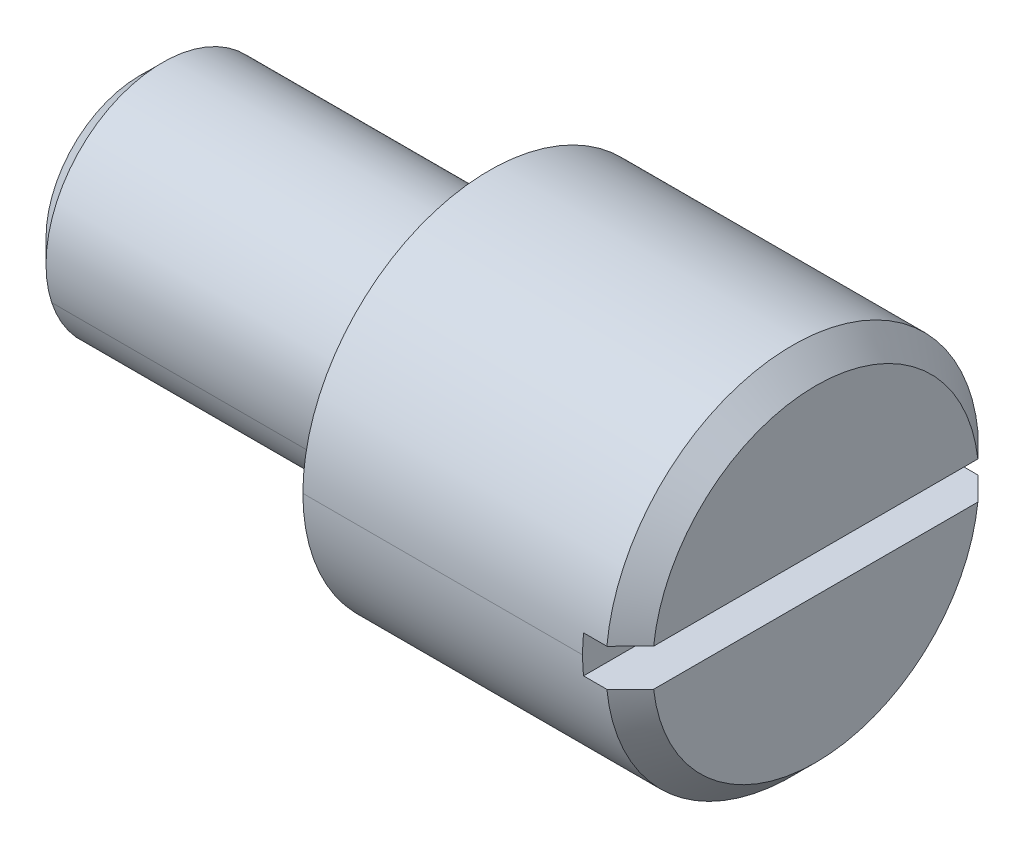
ISO-10303-21;
HEADER;
FILE_DESCRIPTION(('STEP AP214'),'2;1');
FILE_NAME('part.step','',(''),(''),'','','');
FILE_SCHEMA(('AUTOMOTIVE_DESIGN { 1 0 10303 214 1 1 1 1 }'));
ENDSEC;
DATA;
#1=APPLICATION_CONTEXT('core data for automotive mechanical design processes');
#2=APPLICATION_PROTOCOL_DEFINITION('international standard','automotive_design',2000,#1);
#3=PRODUCT_CONTEXT('',#1,'mechanical');
#4=PRODUCT('Part','Part','',(#3));
#5=PRODUCT_RELATED_PRODUCT_CATEGORY('part','',(#4));
#6=PRODUCT_DEFINITION_FORMATION('','',#4);
#7=PRODUCT_DEFINITION_CONTEXT('part definition',#1,'design');
#8=PRODUCT_DEFINITION('design','',#6,#7);
#9=PRODUCT_DEFINITION_SHAPE('','',#8);
#10=(LENGTH_UNIT() NAMED_UNIT(*) SI_UNIT(.MILLI.,.METRE.));
#11=(NAMED_UNIT(*) PLANE_ANGLE_UNIT() SI_UNIT($,.RADIAN.));
#12=(NAMED_UNIT(*) SI_UNIT($,.STERADIAN.) SOLID_ANGLE_UNIT());
#13=UNCERTAINTY_MEASURE_WITH_UNIT(LENGTH_MEASURE(1.E-05),#10,'distance_accuracy_value','');
#14=(GEOMETRIC_REPRESENTATION_CONTEXT(3) GLOBAL_UNCERTAINTY_ASSIGNED_CONTEXT((#13)) GLOBAL_UNIT_ASSIGNED_CONTEXT((#10,
#11,#12)) REPRESENTATION_CONTEXT('',''));
#15=CARTESIAN_POINT('',(0.,0.,0.));
#16=DIRECTION('',(0.,0.,1.));
#17=DIRECTION('',(1.,0.,0.));
#18=AXIS2_PLACEMENT_3D('',#15,#16,#17);
#19=CARTESIAN_POINT('',(7.,0.,0.));
#20=DIRECTION('',(1.,0.,0.));
#21=DIRECTION('',(0.,1.,0.));
#22=AXIS2_PLACEMENT_3D('',#19,#20,#21);
#23=CYLINDRICAL_SURFACE('',#22,4.);
#24=DIRECTION('',(1.,0.,0.));
#25=VECTOR('',#24,1.);
#26=CARTESIAN_POINT('',(0.,0.,4.));
#27=LINE('',#26,#25);
#28=CARTESIAN_POINT('',(0.,0.,4.));
#29=VERTEX_POINT('',#28);
#30=CARTESIAN_POINT('',(6.,0.,4.));
#31=VERTEX_POINT('',#30);
#32=EDGE_CURVE('E10',#29,#31,#27,.T.);
#33=ORIENTED_EDGE('',*,*,#32,.F.);
#34=CARTESIAN_POINT('',(0.,0.,0.));
#35=DIRECTION('',(1.,0.,0.));
#36=DIRECTION('',(0.,0.,-1.));
#37=AXIS2_PLACEMENT_3D('',#34,#35,#36);
#38=CIRCLE('',#37,4.);
#39=CARTESIAN_POINT('',(0.,0.,-4.));
#40=VERTEX_POINT('',#39);
#41=EDGE_CURVE('E24',#29,#40,#38,.T.);
#42=ORIENTED_EDGE('',*,*,#41,.T.);
#43=DIRECTION('',(1.,0.,0.));
#44=VECTOR('',#43,1.);
#45=CARTESIAN_POINT('',(0.,0.,-4.));
#46=LINE('',#45,#44);
#47=CARTESIAN_POINT('',(6.,0.,-4.));
#48=VERTEX_POINT('',#47);
#49=EDGE_CURVE('E420',#40,#48,#46,.T.);
#50=ORIENTED_EDGE('',*,*,#49,.T.);
#51=CARTESIAN_POINT('',(6.,0.,0.));
#52=DIRECTION('',(1.,0.,0.));
#53=DIRECTION('',(0.,0.,-1.));
#54=AXIS2_PLACEMENT_3D('',#51,#52,#53);
#55=CIRCLE('',#54,4.);
#56=CARTESIAN_POINT('',(6.,-0.4,-3.97994974842648));
#57=VERTEX_POINT('',#56);
#58=EDGE_CURVE('E415',#57,#48,#55,.T.);
#59=ORIENTED_EDGE('',*,*,#58,.F.);
#60=DIRECTION('',(-1.,0.,0.));
#61=VECTOR('',#60,1.);
#62=CARTESIAN_POINT('',(7.,-0.4,-3.97994974842648));
#63=LINE('',#62,#61);
#64=CARTESIAN_POINT('',(6.5,-0.4,-3.97994974842648));
#65=VERTEX_POINT('',#64);
#66=EDGE_CURVE('E411',#65,#57,#63,.T.);
#67=ORIENTED_EDGE('',*,*,#66,.F.);
#68=CARTESIAN_POINT('',(6.5,0.,0.));
#69=DIRECTION('',(1.,0.,0.));
#70=DIRECTION('',(0.,0.,-1.));
#71=AXIS2_PLACEMENT_3D('',#68,#69,#70);
#72=CIRCLE('',#71,4.);
#73=CARTESIAN_POINT('',(6.5,-0.4,3.97994974842648));
#74=VERTEX_POINT('',#73);
#75=EDGE_CURVE('E143',#74,#65,#72,.T.);
#76=ORIENTED_EDGE('',*,*,#75,.F.);
#77=DIRECTION('',(1.,0.,0.));
#78=VECTOR('',#77,1.);
#79=CARTESIAN_POINT('',(7.,-0.4,3.97994974842648));
#80=LINE('',#79,#78);
#81=CARTESIAN_POINT('',(6.,-0.4,3.97994974842648));
#82=VERTEX_POINT('',#81);
#83=EDGE_CURVE('E404',#82,#74,#80,.T.);
#84=ORIENTED_EDGE('',*,*,#83,.F.);
#85=CARTESIAN_POINT('',(6.,0.,0.));
#86=DIRECTION('',(1.,0.,0.));
#87=DIRECTION('',(0.,0.,-1.));
#88=AXIS2_PLACEMENT_3D('',#85,#86,#87);
#89=CIRCLE('',#88,4.);
#90=EDGE_CURVE('E399',#31,#82,#89,.T.);
#91=ORIENTED_EDGE('',*,*,#90,.F.);
#92=EDGE_LOOP('',(#33,#42,#50,#59,#67,#76,#84,#91));
#93=FACE_BOUND('',#92,.T.);
#94=ADVANCED_FACE('F16',(#93),#23,.T.);
#95=CARTESIAN_POINT('',(6.,0.4,8.));
#96=DIRECTION('',(1.,0.,0.));
#97=DIRECTION('',(0.,0.,-1.));
#98=AXIS2_PLACEMENT_3D('',#95,#96,#97);
#99=PLANE('',#98);
#100=CARTESIAN_POINT('',(6.,0.,0.));
#101=DIRECTION('',(1.,0.,0.));
#102=DIRECTION('',(0.,0.,-1.));
#103=AXIS2_PLACEMENT_3D('',#100,#101,#102);
#104=CIRCLE('',#103,4.);
#105=CARTESIAN_POINT('',(6.,0.4,3.97994974842648));
#106=VERTEX_POINT('',#105);
#107=EDGE_CURVE('E394',#106,#31,#104,.T.);
#108=ORIENTED_EDGE('',*,*,#107,.T.);
#109=ORIENTED_EDGE('',*,*,#90,.T.);
#110=DIRECTION('',(0.,0.,-1.));
#111=VECTOR('',#110,1.);
#112=CARTESIAN_POINT('',(6.,-0.4,8.));
#113=LINE('',#112,#111);
#114=EDGE_CURVE('E389',#82,#57,#113,.T.);
#115=ORIENTED_EDGE('',*,*,#114,.T.);
#116=ORIENTED_EDGE('',*,*,#58,.T.);
#117=CARTESIAN_POINT('',(6.,0.,0.));
#118=DIRECTION('',(1.,0.,0.));
#119=DIRECTION('',(0.,0.,-1.));
#120=AXIS2_PLACEMENT_3D('',#117,#118,#119);
#121=CIRCLE('',#120,4.);
#122=CARTESIAN_POINT('',(6.,0.4,-3.97994974842648));
#123=VERTEX_POINT('',#122);
#124=EDGE_CURVE('E385',#48,#123,#121,.T.);
#125=ORIENTED_EDGE('',*,*,#124,.T.);
#126=DIRECTION('',(0.,0.,-1.));
#127=VECTOR('',#126,1.);
#128=CARTESIAN_POINT('',(6.,0.4,8.));
#129=LINE('',#128,#127);
#130=EDGE_CURVE('E380',#106,#123,#129,.T.);
#131=ORIENTED_EDGE('',*,*,#130,.F.);
#132=EDGE_LOOP('',(#108,#109,#115,#116,#125,#131));
#133=FACE_BOUND('',#132,.T.);
#134=ADVANCED_FACE('F360',(#133),#99,.T.);
#135=CARTESIAN_POINT('',(7.,0.4,8.));
#136=DIRECTION('',(0.,-1.,0.));
#137=DIRECTION('',(0.,0.,-1.));
#138=AXIS2_PLACEMENT_3D('',#135,#136,#137);
#139=PLANE('',#138);
#140=DIRECTION('',(1.,0.,0.));
#141=VECTOR('',#140,1.);
#142=CARTESIAN_POINT('',(7.,0.4,-3.97994974842648));
#143=LINE('',#142,#141);
#144=CARTESIAN_POINT('',(6.5,0.4,-3.97994974842648));
#145=VERTEX_POINT('',#144);
#146=EDGE_CURVE('E378',#123,#145,#143,.T.);
#147=ORIENTED_EDGE('',*,*,#146,.T.);
#148=CARTESIAN_POINT('',(6.5,0.4,-3.97994974842648));
#149=CARTESIAN_POINT('',(6.66672719356399,0.4,-3.81238261406263));
#150=CARTESIAN_POINT('',(6.83340259039216,0.4,-3.64476389797192));
#151=CARTESIAN_POINT('',(7.,0.4,-3.47706773014274));
#152=B_SPLINE_CURVE_WITH_KNOTS('',3,(#148,#149,#150,#151),.UNSPECIFIED.,.F.,.F.,(4,4),(0.,1.),.UNSPECIFIED.);
#153=CARTESIAN_POINT('',(7.,0.4,-3.47706773014274));
#154=VERTEX_POINT('',#153);
#155=EDGE_CURVE('E376',#145,#154,#152,.T.);
#156=ORIENTED_EDGE('',*,*,#155,.T.);
#157=DIRECTION('',(0.,0.,1.));
#158=VECTOR('',#157,1.);
#159=CARTESIAN_POINT('',(7.,0.4,0.));
#160=LINE('',#159,#158);
#161=CARTESIAN_POINT('',(7.,0.4,3.47706773014274));
#162=VERTEX_POINT('',#161);
#163=EDGE_CURVE('E688',#154,#162,#160,.T.);
#164=ORIENTED_EDGE('',*,*,#163,.T.);
#165=CARTESIAN_POINT('',(7.,0.4,3.47706773014274));
#166=CARTESIAN_POINT('',(6.8334028568546,0.4,3.64476362975208));
#167=CARTESIAN_POINT('',(6.66672692689396,0.4,3.81238288207609));
#168=CARTESIAN_POINT('',(6.5,0.4,3.97994974842648));
#169=B_SPLINE_CURVE_WITH_KNOTS('',3,(#165,#166,#167,#168),.UNSPECIFIED.,.F.,.F.,(4,4),(0.,1.),.UNSPECIFIED.);
#170=CARTESIAN_POINT('',(6.5,0.4,3.97994974842648));
#171=VERTEX_POINT('',#170);
#172=EDGE_CURVE('E221',#162,#171,#169,.T.);
#173=ORIENTED_EDGE('',*,*,#172,.T.);
#174=DIRECTION('',(-1.,0.,0.));
#175=VECTOR('',#174,1.);
#176=CARTESIAN_POINT('',(7.,0.4,3.97994974842648));
#177=LINE('',#176,#175);
#178=EDGE_CURVE('E338',#171,#106,#177,.T.);
#179=ORIENTED_EDGE('',*,*,#178,.T.);
#180=ORIENTED_EDGE('',*,*,#130,.T.);
#181=EDGE_LOOP('',(#147,#156,#164,#173,#179,#180));
#182=FACE_BOUND('',#181,.T.);
#183=ADVANCED_FACE('F350',(#182),#139,.T.);
#184=CARTESIAN_POINT('',(7.,0.,0.));
#185=DIRECTION('',(1.,0.,0.));
#186=DIRECTION('',(0.,-1.,0.));
#187=AXIS2_PLACEMENT_3D('',#184,#185,#186);
#188=CYLINDRICAL_SURFACE('',#187,4.);
#189=ORIENTED_EDGE('',*,*,#32,.T.);
#190=ORIENTED_EDGE('',*,*,#107,.F.);
#191=ORIENTED_EDGE('',*,*,#178,.F.);
#192=CARTESIAN_POINT('',(6.5,0.,0.));
#193=DIRECTION('',(1.,0.,0.));
#194=DIRECTION('',(0.,0.,-1.));
#195=AXIS2_PLACEMENT_3D('',#192,#193,#194);
#196=CIRCLE('',#195,4.);
#197=EDGE_CURVE('E334',#145,#171,#196,.T.);
#198=ORIENTED_EDGE('',*,*,#197,.F.);
#199=ORIENTED_EDGE('',*,*,#146,.F.);
#200=ORIENTED_EDGE('',*,*,#124,.F.);
#201=ORIENTED_EDGE('',*,*,#49,.F.);
#202=CARTESIAN_POINT('',(0.,0.,0.));
#203=DIRECTION('',(1.,0.,0.));
#204=DIRECTION('',(0.,0.,-1.));
#205=AXIS2_PLACEMENT_3D('',#202,#203,#204);
#206=CIRCLE('',#205,4.);
#207=EDGE_CURVE('E330',#40,#29,#206,.T.);
#208=ORIENTED_EDGE('',*,*,#207,.T.);
#209=EDGE_LOOP('',(#189,#190,#191,#198,#199,#200,#201,#208));
#210=FACE_BOUND('',#209,.T.);
#211=ADVANCED_FACE('F359',(#210),#188,.T.);
#212=CARTESIAN_POINT('',(0.,0.,0.));
#213=DIRECTION('',(1.,0.,0.));
#214=DIRECTION('',(0.,0.,-1.));
#215=AXIS2_PLACEMENT_3D('',#212,#213,#214);
#216=PLANE('',#215);
#217=ORIENTED_EDGE('',*,*,#41,.F.);
#218=ORIENTED_EDGE('',*,*,#207,.F.);
#219=EDGE_LOOP('',(#217,#218));
#220=FACE_BOUND('',#219,.T.);
#221=CARTESIAN_POINT('',(0.,0.,0.));
#222=DIRECTION('',(1.,0.,0.));
#223=DIRECTION('',(0.,0.,-1.));
#224=AXIS2_PLACEMENT_3D('',#221,#222,#223);
#225=CIRCLE('',#224,2.0095);
#226=CARTESIAN_POINT('',(0.,0.,-2.0095));
#227=VERTEX_POINT('',#226);
#228=CARTESIAN_POINT('',(0.,0.,2.0095));
#229=VERTEX_POINT('',#228);
#230=EDGE_CURVE('E326',#227,#229,#225,.T.);
#231=ORIENTED_EDGE('',*,*,#230,.T.);
#232=CARTESIAN_POINT('',(0.,0.,0.));
#233=DIRECTION('',(1.,0.,0.));
#234=DIRECTION('',(0.,0.,-1.));
#235=AXIS2_PLACEMENT_3D('',#232,#233,#234);
#236=CIRCLE('',#235,2.0095);
#237=EDGE_CURVE('E322',#229,#227,#236,.T.);
#238=ORIENTED_EDGE('',*,*,#237,.T.);
#239=EDGE_LOOP('',(#231,#238));
#240=FACE_BOUND('',#239,.T.);
#241=ADVANCED_FACE('F438',(#220,#240),#216,.F.);
#242=CARTESIAN_POINT('',(0.,0.,0.));
#243=DIRECTION('',(1.,0.,0.));
#244=DIRECTION('',(0.,1.,0.));
#245=AXIS2_PLACEMENT_3D('',#242,#243,#244);
#246=CYLINDRICAL_SURFACE('',#245,2.0095);
#247=DIRECTION('',(1.,0.,0.));
#248=VECTOR('',#247,1.);
#249=CARTESIAN_POINT('',(-0.5,0.,2.0095));
#250=LINE('',#249,#248);
#251=CARTESIAN_POINT('',(-0.5,0.,2.0095));
#252=VERTEX_POINT('',#251);
#253=EDGE_CURVE('E317',#252,#229,#250,.T.);
#254=ORIENTED_EDGE('',*,*,#253,.F.);
#255=CARTESIAN_POINT('',(-0.5,0.,0.));
#256=DIRECTION('',(1.,0.,0.));
#257=DIRECTION('',(0.,0.,-1.));
#258=AXIS2_PLACEMENT_3D('',#255,#256,#257);
#259=CIRCLE('',#258,2.0095);
#260=CARTESIAN_POINT('',(-0.5,0.,-2.0095));
#261=VERTEX_POINT('',#260);
#262=EDGE_CURVE('E313',#252,#261,#259,.T.);
#263=ORIENTED_EDGE('',*,*,#262,.T.);
#264=DIRECTION('',(1.,0.,0.));
#265=VECTOR('',#264,1.);
#266=CARTESIAN_POINT('',(-0.5,0.,-2.0095));
#267=LINE('',#266,#265);
#268=EDGE_CURVE('E308',#261,#227,#267,.T.);
#269=ORIENTED_EDGE('',*,*,#268,.T.);
#270=ORIENTED_EDGE('',*,*,#237,.F.);
#271=EDGE_LOOP('',(#254,#263,#269,#270));
#272=FACE_BOUND('',#271,.T.);
#273=ADVANCED_FACE('F441',(#272),#246,.T.);
#274=CARTESIAN_POINT('',(0.,0.,0.));
#275=DIRECTION('',(1.,0.,0.));
#276=DIRECTION('',(0.,-1.,0.));
#277=AXIS2_PLACEMENT_3D('',#274,#275,#276);
#278=CYLINDRICAL_SURFACE('',#277,2.0095);
#279=ORIENTED_EDGE('',*,*,#253,.T.);
#280=ORIENTED_EDGE('',*,*,#230,.F.);
#281=ORIENTED_EDGE('',*,*,#268,.F.);
#282=CARTESIAN_POINT('',(-0.5,0.,0.));
#283=DIRECTION('',(1.,0.,0.));
#284=DIRECTION('',(0.,0.,-1.));
#285=AXIS2_PLACEMENT_3D('',#282,#283,#284);
#286=CIRCLE('',#285,2.0095);
#287=EDGE_CURVE('E303',#261,#252,#286,.T.);
#288=ORIENTED_EDGE('',*,*,#287,.T.);
#289=EDGE_LOOP('',(#279,#280,#281,#288));
#290=FACE_BOUND('',#289,.T.);
#291=ADVANCED_FACE('F447',(#290),#278,.T.);
#292=CARTESIAN_POINT('',(-0.9905,0.,0.));
#293=DIRECTION('',(-1.,0.,0.));
#294=DIRECTION('',(0.,-1.,0.));
#295=AXIS2_PLACEMENT_3D('',#292,#293,#294);
#296=CONICAL_SURFACE('',#295,2.5,0.785398163397448);
#297=DIRECTION('',(-0.707106781186548,0.,-0.707106781186547));
#298=VECTOR('',#297,1.);
#299=CARTESIAN_POINT('',(-0.5,0.,-2.0095));
#300=LINE('',#299,#298);
#301=CARTESIAN_POINT('',(-0.9905,0.,-2.5));
#302=VERTEX_POINT('',#301);
#303=EDGE_CURVE('E299',#261,#302,#300,.T.);
#304=ORIENTED_EDGE('',*,*,#303,.T.);
#305=CARTESIAN_POINT('',(-0.9905,0.,0.));
#306=DIRECTION('',(1.,0.,0.));
#307=DIRECTION('',(0.,0.,-1.));
#308=AXIS2_PLACEMENT_3D('',#305,#306,#307);
#309=CIRCLE('',#308,2.5);
#310=CARTESIAN_POINT('',(-0.9905,0.,2.5));
#311=VERTEX_POINT('',#310);
#312=EDGE_CURVE('E295',#302,#311,#309,.T.);
#313=ORIENTED_EDGE('',*,*,#312,.T.);
#314=DIRECTION('',(-0.707106781186548,0.,0.707106781186547));
#315=VECTOR('',#314,1.);
#316=CARTESIAN_POINT('',(-0.5,0.,2.0095));
#317=LINE('',#316,#315);
#318=EDGE_CURVE('E290',#252,#311,#317,.T.);
#319=ORIENTED_EDGE('',*,*,#318,.F.);
#320=ORIENTED_EDGE('',*,*,#287,.F.);
#321=EDGE_LOOP('',(#304,#313,#319,#320));
#322=FACE_BOUND('',#321,.T.);
#323=ADVANCED_FACE('F452',(#322),#296,.T.);
#324=CARTESIAN_POINT('',(-0.9905,0.,0.));
#325=DIRECTION('',(-1.,0.,0.));
#326=DIRECTION('',(0.,1.,0.));
#327=AXIS2_PLACEMENT_3D('',#324,#325,#326);
#328=CONICAL_SURFACE('',#327,2.5,0.785398163397448);
#329=ORIENTED_EDGE('',*,*,#303,.F.);
#330=ORIENTED_EDGE('',*,*,#262,.F.);
#331=ORIENTED_EDGE('',*,*,#318,.T.);
#332=CARTESIAN_POINT('',(-0.9905,0.,0.));
#333=DIRECTION('',(1.,0.,0.));
#334=DIRECTION('',(0.,0.,-1.));
#335=AXIS2_PLACEMENT_3D('',#332,#333,#334);
#336=CIRCLE('',#335,2.5);
#337=CARTESIAN_POINT('',(-0.990500000000001,-0.772542485937367,2.37764129073788));
#338=VERTEX_POINT('',#337);
#339=EDGE_CURVE('E286',#311,#338,#336,.T.);
#340=ORIENTED_EDGE('',*,*,#339,.T.);
#341=CARTESIAN_POINT('',(-0.9905,0.,0.));
#342=DIRECTION('',(1.,0.,0.));
#343=DIRECTION('',(0.,0.,-1.));
#344=AXIS2_PLACEMENT_3D('',#341,#342,#343);
#345=CIRCLE('',#344,2.5);
#346=EDGE_CURVE('E281',#338,#302,#345,.T.);
#347=ORIENTED_EDGE('',*,*,#346,.T.);
#348=EDGE_LOOP('',(#329,#330,#331,#340,#347));
#349=FACE_BOUND('',#348,.T.);
#350=ADVANCED_FACE('F457',(#349),#328,.T.);
#351=CARTESIAN_POINT('',(0.,0.,0.));
#352=DIRECTION('',(1.,0.,0.));
#353=DIRECTION('',(0.,0.987688340595138,0.156434465040231));
#354=AXIS2_PLACEMENT_3D('',#351,#352,#353);
#355=CYLINDRICAL_SURFACE('',#354,2.5);
#356=DIRECTION('',(1.,0.,0.));
#357=VECTOR('',#356,1.);
#358=CARTESIAN_POINT('',(-7.0095,-0.772542485937367,2.37764129073788));
#359=LINE('',#358,#357);
#360=CARTESIAN_POINT('',(-7.0095,-0.772542485937367,2.37764129073788));
#361=VERTEX_POINT('',#360);
#362=EDGE_CURVE('E276',#361,#338,#359,.T.);
#363=ORIENTED_EDGE('',*,*,#362,.F.);
#364=CARTESIAN_POINT('',(-7.0095,0.,0.));
#365=DIRECTION('',(1.,0.,0.));
#366=DIRECTION('',(0.,0.,-1.));
#367=AXIS2_PLACEMENT_3D('',#364,#365,#366);
#368=CIRCLE('',#367,2.5);
#369=CARTESIAN_POINT('',(-7.0095,0.,-2.5));
#370=VERTEX_POINT('',#369);
#371=EDGE_CURVE('E272',#361,#370,#368,.T.);
#372=ORIENTED_EDGE('',*,*,#371,.T.);
#373=DIRECTION('',(1.,0.,0.));
#374=VECTOR('',#373,1.);
#375=CARTESIAN_POINT('',(-7.0095,0.,-2.5));
#376=LINE('',#375,#374);
#377=EDGE_CURVE('E267',#370,#302,#376,.T.);
#378=ORIENTED_EDGE('',*,*,#377,.T.);
#379=ORIENTED_EDGE('',*,*,#346,.F.);
#380=EDGE_LOOP('',(#363,#372,#378,#379));
#381=FACE_BOUND('',#380,.T.);
#382=ADVANCED_FACE('F461',(#381),#355,.T.);
#383=CARTESIAN_POINT('',(0.,0.,0.));
#384=DIRECTION('',(1.,0.,0.));
#385=DIRECTION('',(0.,-0.987688340595138,-0.156434465040231));
#386=AXIS2_PLACEMENT_3D('',#383,#384,#385);
#387=CYLINDRICAL_SURFACE('',#386,2.5);
#388=ORIENTED_EDGE('',*,*,#362,.T.);
#389=ORIENTED_EDGE('',*,*,#339,.F.);
#390=ORIENTED_EDGE('',*,*,#312,.F.);
#391=ORIENTED_EDGE('',*,*,#377,.F.);
#392=CARTESIAN_POINT('',(-7.0095,0.,0.));
#393=DIRECTION('',(1.,0.,0.));
#394=DIRECTION('',(0.,0.,-1.));
#395=AXIS2_PLACEMENT_3D('',#392,#393,#394);
#396=CIRCLE('',#395,2.5);
#397=CARTESIAN_POINT('',(-7.0095,0.,2.5));
#398=VERTEX_POINT('',#397);
#399=EDGE_CURVE('E263',#370,#398,#396,.T.);
#400=ORIENTED_EDGE('',*,*,#399,.T.);
#401=CARTESIAN_POINT('',(-7.0095,0.,0.));
#402=DIRECTION('',(1.,0.,0.));
#403=DIRECTION('',(0.,0.,-1.));
#404=AXIS2_PLACEMENT_3D('',#401,#402,#403);
#405=CIRCLE('',#404,2.5);
#406=EDGE_CURVE('E258',#398,#361,#405,.T.);
#407=ORIENTED_EDGE('',*,*,#406,.T.);
#408=EDGE_LOOP('',(#388,#389,#390,#391,#400,#407));
#409=FACE_BOUND('',#408,.T.);
#410=ADVANCED_FACE('F464',(#409),#387,.T.);
#411=CARTESIAN_POINT('',(-7.5,0.,0.));
#412=DIRECTION('',(1.,0.,0.));
#413=DIRECTION('',(0.,1.,0.));
#414=AXIS2_PLACEMENT_3D('',#411,#412,#413);
#415=CONICAL_SURFACE('',#414,2.0095,0.785398163397449);
#416=DIRECTION('',(0.707106781186547,0.,0.707106781186548));
#417=VECTOR('',#416,1.);
#418=CARTESIAN_POINT('',(-7.5,0.,2.0095));
#419=LINE('',#418,#417);
#420=CARTESIAN_POINT('',(-7.5,0.,2.0095));
#421=VERTEX_POINT('',#420);
#422=EDGE_CURVE('E253',#421,#398,#419,.T.);
#423=ORIENTED_EDGE('',*,*,#422,.F.);
#424=CARTESIAN_POINT('',(-7.5,0.,0.));
#425=DIRECTION('',(1.,0.,0.));
#426=DIRECTION('',(0.,0.,-1.));
#427=AXIS2_PLACEMENT_3D('',#424,#425,#426);
#428=CIRCLE('',#427,2.0095);
#429=CARTESIAN_POINT('',(-7.5,0.,-2.0095));
#430=VERTEX_POINT('',#429);
#431=EDGE_CURVE('E249',#421,#430,#428,.T.);
#432=ORIENTED_EDGE('',*,*,#431,.T.);
#433=DIRECTION('',(0.707106781186547,0.,-0.707106781186548));
#434=VECTOR('',#433,1.);
#435=CARTESIAN_POINT('',(-7.5,0.,-2.0095));
#436=LINE('',#435,#434);
#437=EDGE_CURVE('E244',#430,#370,#436,.T.);
#438=ORIENTED_EDGE('',*,*,#437,.T.);
#439=ORIENTED_EDGE('',*,*,#371,.F.);
#440=ORIENTED_EDGE('',*,*,#406,.F.);
#441=EDGE_LOOP('',(#423,#432,#438,#439,#440));
#442=FACE_BOUND('',#441,.T.);
#443=ADVANCED_FACE('F468',(#442),#415,.T.);
#444=CARTESIAN_POINT('',(-7.5,0.,0.));
#445=DIRECTION('',(1.,0.,0.));
#446=DIRECTION('',(0.,-1.,0.));
#447=AXIS2_PLACEMENT_3D('',#444,#445,#446);
#448=CONICAL_SURFACE('',#447,2.0095,0.785398163397449);
#449=ORIENTED_EDGE('',*,*,#422,.T.);
#450=ORIENTED_EDGE('',*,*,#399,.F.);
#451=ORIENTED_EDGE('',*,*,#437,.F.);
#452=CARTESIAN_POINT('',(-7.5,0.,0.));
#453=DIRECTION('',(1.,0.,0.));
#454=DIRECTION('',(0.,0.,-1.));
#455=AXIS2_PLACEMENT_3D('',#452,#453,#454);
#456=CIRCLE('',#455,2.0095);
#457=EDGE_CURVE('E239',#430,#421,#456,.T.);
#458=ORIENTED_EDGE('',*,*,#457,.T.);
#459=EDGE_LOOP('',(#449,#450,#451,#458));
#460=FACE_BOUND('',#459,.T.);
#461=ADVANCED_FACE('F473',(#460),#448,.T.);
#462=CARTESIAN_POINT('',(-7.5,0.49999520497701,0.));
#463=DIRECTION('',(1.,0.,0.));
#464=DIRECTION('',(0.,0.,-1.));
#465=AXIS2_PLACEMENT_3D('',#462,#463,#464);
#466=PLANE('',#465);
#467=ORIENTED_EDGE('',*,*,#431,.F.);
#468=ORIENTED_EDGE('',*,*,#457,.F.);
#469=EDGE_LOOP('',(#467,#468));
#470=FACE_BOUND('',#469,.T.);
#471=CARTESIAN_POINT('',(-7.5,0.,0.));
#472=DIRECTION('',(1.,0.,0.));
#473=DIRECTION('',(0.,0.,-1.));
#474=AXIS2_PLACEMENT_3D('',#471,#472,#473);
#475=CIRCLE('',#474,0.49999520497701);
#476=CARTESIAN_POINT('',(-7.5,0.,-0.49999520497701));
#477=VERTEX_POINT('',#476);
#478=CARTESIAN_POINT('',(-7.5,0.,0.49999520497701));
#479=VERTEX_POINT('',#478);
#480=EDGE_CURVE('E235',#477,#479,#475,.T.);
#481=ORIENTED_EDGE('',*,*,#480,.T.);
#482=CARTESIAN_POINT('',(-7.5,0.,0.));
#483=DIRECTION('',(1.,0.,0.));
#484=DIRECTION('',(0.,0.,-1.));
#485=AXIS2_PLACEMENT_3D('',#482,#483,#484);
#486=CIRCLE('',#485,0.49999520497701);
#487=EDGE_CURVE('E231',#479,#477,#486,.T.);
#488=ORIENTED_EDGE('',*,*,#487,.T.);
#489=EDGE_LOOP('',(#481,#488));
#490=FACE_BOUND('',#489,.T.);
#491=ADVANCED_FACE('F475',(#470,#490),#466,.F.);
#492=CARTESIAN_POINT('',(-7.000004795023,0.,0.));
#493=DIRECTION('',(-1.,0.,0.));
#494=DIRECTION('',(0.,1.,0.));
#495=AXIS2_PLACEMENT_3D('',#492,#493,#494);
#496=CONICAL_SURFACE('',#495,0.,0.785398163397459);
#497=DIRECTION('',(-0.70710678118654,0.,-0.707106781186555));
#498=VECTOR('',#497,1.);
#499=CARTESIAN_POINT('',(-7.000004795023,0.,0.));
#500=LINE('',#499,#498);
#501=CARTESIAN_POINT('',(-7.000004795023,0.,0.));
#502=VERTEX_POINT('',#501);
#503=EDGE_CURVE('E225',#502,#477,#500,.T.);
#504=ORIENTED_EDGE('',*,*,#503,.T.);
#505=ORIENTED_EDGE('',*,*,#487,.F.);
#506=DIRECTION('',(-0.70710678118654,0.,0.707106781186555));
#507=VECTOR('',#506,1.);
#508=CARTESIAN_POINT('',(-7.000004795023,0.,0.));
#509=LINE('',#508,#507);
#510=EDGE_CURVE('E222',#502,#479,#509,.T.);
#511=ORIENTED_EDGE('',*,*,#510,.F.);
#512=EDGE_LOOP('',(#504,#505,#511));
#513=FACE_BOUND('',#512,.T.);
#514=ADVANCED_FACE('F478',(#513),#496,.F.);
#515=CARTESIAN_POINT('',(-7.000004795023,0.,0.));
#516=DIRECTION('',(-1.,0.,0.));
#517=DIRECTION('',(0.,-1.,0.));
#518=AXIS2_PLACEMENT_3D('',#515,#516,#517);
#519=CONICAL_SURFACE('',#518,0.,0.785398163397459);
#520=ORIENTED_EDGE('',*,*,#510,.T.);
#521=ORIENTED_EDGE('',*,*,#480,.F.);
#522=ORIENTED_EDGE('',*,*,#503,.F.);
#523=EDGE_LOOP('',(#520,#521,#522));
#524=FACE_BOUND('',#523,.T.);
#525=ADVANCED_FACE('F202',(#524),#519,.F.);
#526=CARTESIAN_POINT('',(6.5,0.,0.));
#527=DIRECTION('',(-1.,0.,0.));
#528=DIRECTION('',(0.,-1.,0.));
#529=AXIS2_PLACEMENT_3D('',#526,#527,#528);
#530=CONICAL_SURFACE('',#529,4.,0.785398163397449);
#531=ORIENTED_EDGE('',*,*,#172,.F.);
#532=CARTESIAN_POINT('',(7.,0.,0.));
#533=DIRECTION('',(1.,0.,0.));
#534=DIRECTION('',(0.,0.,-1.));
#535=AXIS2_PLACEMENT_3D('',#532,#533,#534);
#536=CIRCLE('',#535,3.5);
#537=EDGE_CURVE('E226',#154,#162,#536,.T.);
#538=ORIENTED_EDGE('',*,*,#537,.F.);
#539=ORIENTED_EDGE('',*,*,#155,.F.);
#540=ORIENTED_EDGE('',*,*,#197,.T.);
#541=EDGE_LOOP('',(#531,#538,#539,#540));
#542=FACE_BOUND('',#541,.T.);
#543=ADVANCED_FACE('F193',(#542),#530,.T.);
#544=CARTESIAN_POINT('',(7.,3.5,0.));
#545=DIRECTION('',(-1.,0.,0.));
#546=DIRECTION('',(0.,0.,1.));
#547=AXIS2_PLACEMENT_3D('',#544,#545,#546);
#548=PLANE('',#547);
#549=ORIENTED_EDGE('',*,*,#537,.T.);
#550=ORIENTED_EDGE('',*,*,#163,.F.);
#551=EDGE_LOOP('',(#549,#550));
#552=FACE_BOUND('',#551,.T.);
#553=ADVANCED_FACE('F167',(#552),#548,.F.);
#554=CARTESIAN_POINT('',(6.,-0.4,8.));
#555=DIRECTION('',(0.,1.,0.));
#556=DIRECTION('',(0.,0.,1.));
#557=AXIS2_PLACEMENT_3D('',#554,#555,#556);
#558=PLANE('',#557);
#559=ORIENTED_EDGE('',*,*,#83,.T.);
#560=CARTESIAN_POINT('',(6.5,-0.4,3.97994974842648));
#561=CARTESIAN_POINT('',(6.66672719356399,-0.4,3.81238261406263));
#562=CARTESIAN_POINT('',(6.83340259039216,-0.4,3.64476389797192));
#563=CARTESIAN_POINT('',(7.,-0.4,3.47706773014274));
#564=B_SPLINE_CURVE_WITH_KNOTS('',3,(#560,#561,#562,#563),.UNSPECIFIED.,.F.,.F.,(4,4),(0.,1.),.UNSPECIFIED.);
#565=CARTESIAN_POINT('',(7.,-0.4,3.47706773014274));
#566=VERTEX_POINT('',#565);
#567=EDGE_CURVE('E132',#74,#566,#564,.T.);
#568=ORIENTED_EDGE('',*,*,#567,.T.);
#569=DIRECTION('',(0.,0.,-1.));
#570=VECTOR('',#569,1.);
#571=CARTESIAN_POINT('',(7.,-0.4,8.));
#572=LINE('',#571,#570);
#573=CARTESIAN_POINT('',(7.,-0.4,-3.47706773014274));
#574=VERTEX_POINT('',#573);
#575=EDGE_CURVE('E122',#566,#574,#572,.T.);
#576=ORIENTED_EDGE('',*,*,#575,.T.);
#577=CARTESIAN_POINT('',(7.,-0.4,-3.47706773014274));
#578=CARTESIAN_POINT('',(6.8334028568546,-0.4,-3.64476362975208));
#579=CARTESIAN_POINT('',(6.66672692689396,-0.4,-3.81238288207609));
#580=CARTESIAN_POINT('',(6.5,-0.4,-3.97994974842647));
#581=B_SPLINE_CURVE_WITH_KNOTS('',3,(#577,#578,#579,#580),.UNSPECIFIED.,.F.,.F.,(4,4),(0.,1.),.UNSPECIFIED.);
#582=EDGE_CURVE('E128',#574,#65,#581,.T.);
#583=ORIENTED_EDGE('',*,*,#582,.T.);
#584=ORIENTED_EDGE('',*,*,#66,.T.);
#585=ORIENTED_EDGE('',*,*,#114,.F.);
#586=EDGE_LOOP('',(#559,#568,#576,#583,#584,#585));
#587=FACE_BOUND('',#586,.T.);
#588=ADVANCED_FACE('F125',(#587),#558,.T.);
#589=CARTESIAN_POINT('',(6.5,0.,0.));
#590=DIRECTION('',(-1.,0.,0.));
#591=DIRECTION('',(0.,1.,0.));
#592=AXIS2_PLACEMENT_3D('',#589,#590,#591);
#593=CONICAL_SURFACE('',#592,4.,0.785398163397449);
#594=ORIENTED_EDGE('',*,*,#567,.F.);
#595=ORIENTED_EDGE('',*,*,#75,.T.);
#596=ORIENTED_EDGE('',*,*,#582,.F.);
#597=CARTESIAN_POINT('',(7.,0.,0.));
#598=DIRECTION('',(1.,0.,0.));
#599=DIRECTION('',(0.,0.,-1.));
#600=AXIS2_PLACEMENT_3D('',#597,#598,#599);
#601=CIRCLE('',#600,3.5);
#602=EDGE_CURVE('E137',#566,#574,#601,.T.);
#603=ORIENTED_EDGE('',*,*,#602,.F.);
#604=EDGE_LOOP('',(#594,#595,#596,#603));
#605=FACE_BOUND('',#604,.T.);
#606=ADVANCED_FACE('F142',(#605),#593,.T.);
#607=CARTESIAN_POINT('',(7.,3.5,0.));
#608=DIRECTION('',(-1.,0.,0.));
#609=DIRECTION('',(0.,0.,1.));
#610=AXIS2_PLACEMENT_3D('',#607,#608,#609);
#611=PLANE('',#610);
#612=ORIENTED_EDGE('',*,*,#575,.F.);
#613=ORIENTED_EDGE('',*,*,#602,.T.);
#614=EDGE_LOOP('',(#612,#613));
#615=FACE_BOUND('',#614,.T.);
#616=ADVANCED_FACE('F138',(#615),#611,.F.);
#617=CLOSED_SHELL('',(#94,#134,#183,#211,#241,#273,#291,#323,#350,#382,#410,#443,#461,#491,#514,
#525,#543,#553,#588,#606,#616));
#618=MANIFOLD_SOLID_BREP('B1',#617);
#619=ADVANCED_BREP_SHAPE_REPRESENTATION('',(#18,#618),#14);
#620=SHAPE_DEFINITION_REPRESENTATION(#9,#619);
ENDSEC;
END-ISO-10303-21;
